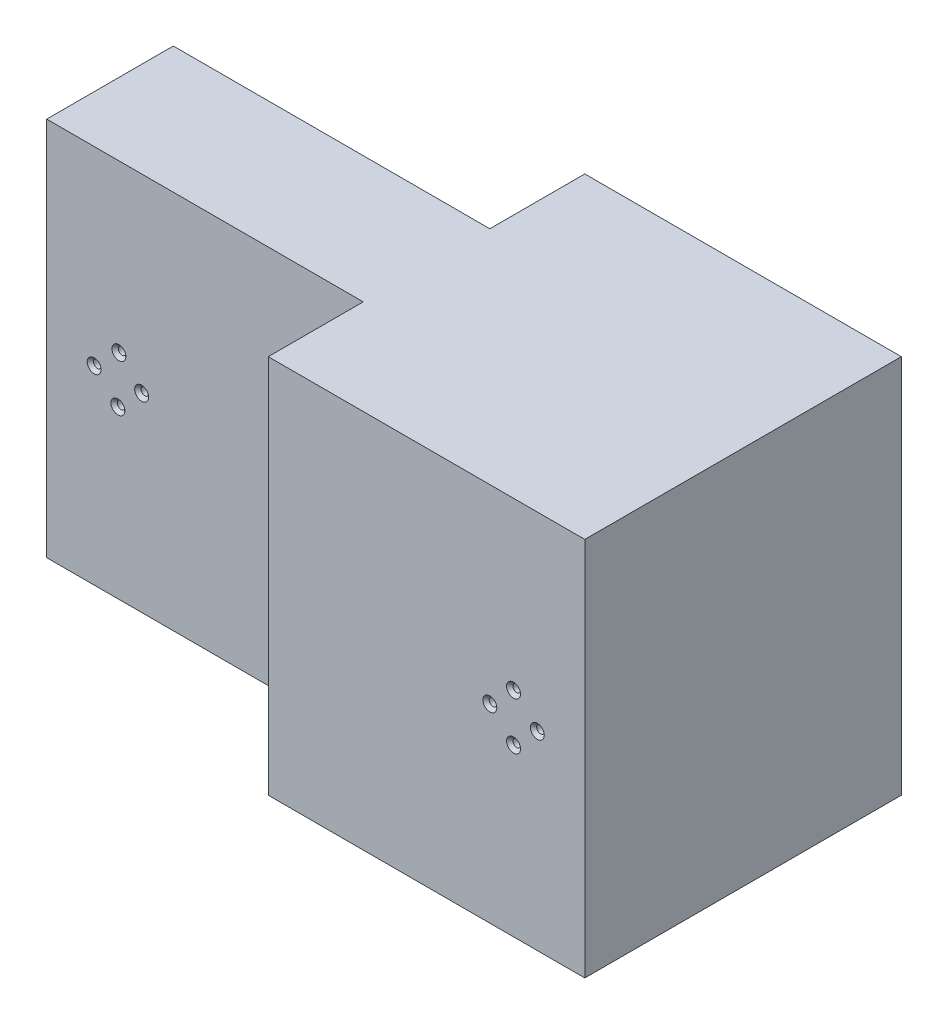
ISO-10303-21;
HEADER;
FILE_DESCRIPTION(('STEP AP214'),'2;1');
FILE_NAME('part.step','',(''),(''),'','','');
FILE_SCHEMA(('AUTOMOTIVE_DESIGN { 1 0 10303 214 1 1 1 1 }'));
ENDSEC;
DATA;
#1=APPLICATION_CONTEXT('core data for automotive mechanical design processes');
#2=APPLICATION_PROTOCOL_DEFINITION('international standard','automotive_design',2000,#1);
#3=PRODUCT_CONTEXT('',#1,'mechanical');
#4=PRODUCT('Part','Part','',(#3));
#5=PRODUCT_RELATED_PRODUCT_CATEGORY('part','',(#4));
#6=PRODUCT_DEFINITION_FORMATION('','',#4);
#7=PRODUCT_DEFINITION_CONTEXT('part definition',#1,'design');
#8=PRODUCT_DEFINITION('design','',#6,#7);
#9=PRODUCT_DEFINITION_SHAPE('','',#8);
#10=(LENGTH_UNIT() NAMED_UNIT(*) SI_UNIT(.MILLI.,.METRE.));
#11=(NAMED_UNIT(*) PLANE_ANGLE_UNIT() SI_UNIT($,.RADIAN.));
#12=(NAMED_UNIT(*) SI_UNIT($,.STERADIAN.) SOLID_ANGLE_UNIT());
#13=UNCERTAINTY_MEASURE_WITH_UNIT(LENGTH_MEASURE(1.E-05),#10,'distance_accuracy_value','');
#14=(GEOMETRIC_REPRESENTATION_CONTEXT(3) GLOBAL_UNCERTAINTY_ASSIGNED_CONTEXT((#13)) GLOBAL_UNIT_ASSIGNED_CONTEXT((#10,
#11,#12)) REPRESENTATION_CONTEXT('',''));
#15=CARTESIAN_POINT('',(0.,0.,0.));
#16=DIRECTION('',(0.,0.,1.));
#17=DIRECTION('',(1.,0.,0.));
#18=AXIS2_PLACEMENT_3D('',#15,#16,#17);
#19=CARTESIAN_POINT('',(-100.,120.,-50.));
#20=DIRECTION('',(1.,0.,0.));
#21=DIRECTION('',(0.,0.,-1.));
#22=AXIS2_PLACEMENT_3D('',#19,#20,#21);
#23=PLANE('',#22);
#24=DIRECTION('',(0.,0.,1.));
#25=VECTOR('',#24,1.);
#26=CARTESIAN_POINT('',(-100.,120.,-50.));
#27=LINE('',#26,#25);
#28=CARTESIAN_POINT('',(-100.,120.,-20.));
#29=VERTEX_POINT('',#28);
#30=CARTESIAN_POINT('',(-100.,120.,20.));
#31=VERTEX_POINT('',#30);
#32=EDGE_CURVE('E184',#29,#31,#27,.T.);
#33=ORIENTED_EDGE('',*,*,#32,.F.);
#34=DIRECTION('',(0.,1.,0.));
#35=VECTOR('',#34,1.);
#36=CARTESIAN_POINT('',(-100.,120.,-20.));
#37=LINE('',#36,#35);
#38=CARTESIAN_POINT('',(-100.,0.,-20.));
#39=VERTEX_POINT('',#38);
#40=EDGE_CURVE('E170',#39,#29,#37,.T.);
#41=ORIENTED_EDGE('',*,*,#40,.F.);
#42=DIRECTION('',(0.,0.,1.));
#43=VECTOR('',#42,1.);
#44=CARTESIAN_POINT('',(-100.,0.,-50.));
#45=LINE('',#44,#43);
#46=CARTESIAN_POINT('',(-100.,0.,20.));
#47=VERTEX_POINT('',#46);
#48=EDGE_CURVE('E129',#39,#47,#45,.T.);
#49=ORIENTED_EDGE('',*,*,#48,.T.);
#50=DIRECTION('',(0.,-1.,0.));
#51=VECTOR('',#50,1.);
#52=CARTESIAN_POINT('',(-100.,120.,20.));
#53=LINE('',#52,#51);
#54=EDGE_CURVE('E190',#31,#47,#53,.T.);
#55=ORIENTED_EDGE('',*,*,#54,.F.);
#56=EDGE_LOOP('',(#33,#41,#49,#55));
#57=FACE_BOUND('',#56,.T.);
#58=ADVANCED_FACE('F43',(#57),#23,.F.);
#59=CARTESIAN_POINT('',(100.,120.,-50.));
#60=DIRECTION('',(-1.,0.,0.));
#61=DIRECTION('',(0.,0.,1.));
#62=AXIS2_PLACEMENT_3D('',#59,#60,#61);
#63=PLANE('',#62);
#64=DIRECTION('',(0.,0.,-1.));
#65=VECTOR('',#64,1.);
#66=CARTESIAN_POINT('',(100.,0.,-50.));
#67=LINE('',#66,#65);
#68=CARTESIAN_POINT('',(100.,0.,50.));
#69=VERTEX_POINT('',#68);
#70=CARTESIAN_POINT('',(100.,0.,-50.));
#71=VERTEX_POINT('',#70);
#72=EDGE_CURVE('E203',#69,#71,#67,.T.);
#73=ORIENTED_EDGE('',*,*,#72,.T.);
#74=DIRECTION('',(0.,-1.,0.));
#75=VECTOR('',#74,1.);
#76=CARTESIAN_POINT('',(100.,120.,-50.));
#77=LINE('',#76,#75);
#78=CARTESIAN_POINT('',(100.,120.,-50.));
#79=VERTEX_POINT('',#78);
#80=EDGE_CURVE('E220',#79,#71,#77,.T.);
#81=ORIENTED_EDGE('',*,*,#80,.F.);
#82=DIRECTION('',(0.,0.,-1.));
#83=VECTOR('',#82,1.);
#84=CARTESIAN_POINT('',(100.,120.,-50.));
#85=LINE('',#84,#83);
#86=CARTESIAN_POINT('',(100.,120.,50.));
#87=VERTEX_POINT('',#86);
#88=EDGE_CURVE('E199',#87,#79,#85,.T.);
#89=ORIENTED_EDGE('',*,*,#88,.F.);
#90=DIRECTION('',(0.,-1.,0.));
#91=VECTOR('',#90,1.);
#92=CARTESIAN_POINT('',(100.,120.,50.));
#93=LINE('',#92,#91);
#94=EDGE_CURVE('E197',#87,#69,#93,.T.);
#95=ORIENTED_EDGE('',*,*,#94,.T.);
#96=EDGE_LOOP('',(#73,#81,#89,#95));
#97=FACE_BOUND('',#96,.T.);
#98=ADVANCED_FACE('F427',(#97),#63,.F.);
#99=CARTESIAN_POINT('',(-100.,120.,-50.));
#100=DIRECTION('',(0.,0.,1.));
#101=DIRECTION('',(1.,0.,0.));
#102=AXIS2_PLACEMENT_3D('',#99,#100,#101);
#103=PLANE('',#102);
#104=DIRECTION('',(-1.,0.,0.));
#105=VECTOR('',#104,1.);
#106=CARTESIAN_POINT('',(-100.,0.,-50.));
#107=LINE('',#106,#105);
#108=CARTESIAN_POINT('',(0.,0.,-50.));
#109=VERTEX_POINT('',#108);
#110=EDGE_CURVE('E207',#71,#109,#107,.T.);
#111=ORIENTED_EDGE('',*,*,#110,.T.);
#112=DIRECTION('',(0.,-1.,0.));
#113=VECTOR('',#112,1.);
#114=CARTESIAN_POINT('',(0.,120.,-50.));
#115=LINE('',#114,#113);
#116=CARTESIAN_POINT('',(0.,120.,-50.));
#117=VERTEX_POINT('',#116);
#118=EDGE_CURVE('E179',#117,#109,#115,.T.);
#119=ORIENTED_EDGE('',*,*,#118,.F.);
#120=DIRECTION('',(-1.,0.,0.));
#121=VECTOR('',#120,1.);
#122=CARTESIAN_POINT('',(-100.,120.,-50.));
#123=LINE('',#122,#121);
#124=EDGE_CURVE('E193',#79,#117,#123,.T.);
#125=ORIENTED_EDGE('',*,*,#124,.F.);
#126=ORIENTED_EDGE('',*,*,#80,.T.);
#127=EDGE_LOOP('',(#111,#119,#125,#126));
#128=FACE_BOUND('',#127,.T.);
#129=ADVANCED_FACE('F430',(#128),#103,.F.);
#130=CARTESIAN_POINT('',(-100.,120.,50.));
#131=DIRECTION('',(0.,0.,-1.));
#132=DIRECTION('',(-1.,0.,0.));
#133=AXIS2_PLACEMENT_3D('',#130,#131,#132);
#134=PLANE('',#133);
#135=CARTESIAN_POINT('',(85.,60.,50.));
#136=DIRECTION('',(0.,0.,1.));
#137=DIRECTION('',(1.,0.,0.));
#138=AXIS2_PLACEMENT_3D('',#135,#136,#137);
#139=CIRCLE('',#138,2.19999999999999);
#140=CARTESIAN_POINT('',(87.2,60.,50.));
#141=VERTEX_POINT('',#140);
#142=EDGE_CURVE('E326',#141,#141,#139,.T.);
#143=ORIENTED_EDGE('',*,*,#142,.F.);
#144=EDGE_LOOP('',(#143));
#145=FACE_BOUND('',#144,.T.);
#146=CARTESIAN_POINT('',(70.,60.,50.));
#147=DIRECTION('',(0.,0.,1.));
#148=DIRECTION('',(1.,0.,0.));
#149=AXIS2_PLACEMENT_3D('',#146,#147,#148);
#150=CIRCLE('',#149,2.19999999999999);
#151=CARTESIAN_POINT('',(72.2,60.,50.));
#152=VERTEX_POINT('',#151);
#153=EDGE_CURVE('E320',#152,#152,#150,.T.);
#154=ORIENTED_EDGE('',*,*,#153,.F.);
#155=EDGE_LOOP('',(#154));
#156=FACE_BOUND('',#155,.T.);
#157=CARTESIAN_POINT('',(77.5,67.5,50.));
#158=DIRECTION('',(0.,0.,1.));
#159=DIRECTION('',(1.,0.,0.));
#160=AXIS2_PLACEMENT_3D('',#157,#158,#159);
#161=CIRCLE('',#160,2.19999999999999);
#162=CARTESIAN_POINT('',(79.7,67.5,50.));
#163=VERTEX_POINT('',#162);
#164=EDGE_CURVE('E314',#163,#163,#161,.T.);
#165=ORIENTED_EDGE('',*,*,#164,.F.);
#166=EDGE_LOOP('',(#165));
#167=FACE_BOUND('',#166,.T.);
#168=CARTESIAN_POINT('',(77.5,52.5,50.));
#169=DIRECTION('',(0.,0.,1.));
#170=DIRECTION('',(1.,0.,0.));
#171=AXIS2_PLACEMENT_3D('',#168,#169,#170);
#172=CIRCLE('',#171,2.19999999999999);
#173=CARTESIAN_POINT('',(79.7,52.5,50.));
#174=VERTEX_POINT('',#173);
#175=EDGE_CURVE('E308',#174,#174,#172,.T.);
#176=ORIENTED_EDGE('',*,*,#175,.F.);
#177=EDGE_LOOP('',(#176));
#178=FACE_BOUND('',#177,.T.);
#179=DIRECTION('',(1.,0.,0.));
#180=VECTOR('',#179,1.);
#181=CARTESIAN_POINT('',(-100.,120.,50.));
#182=LINE('',#181,#180);
#183=CARTESIAN_POINT('',(0.,120.,50.));
#184=VERTEX_POINT('',#183);
#185=EDGE_CURVE('E192',#184,#87,#182,.T.);
#186=ORIENTED_EDGE('',*,*,#185,.F.);
#187=DIRECTION('',(0.,1.,0.));
#188=VECTOR('',#187,1.);
#189=CARTESIAN_POINT('',(0.,120.,50.));
#190=LINE('',#189,#188);
#191=CARTESIAN_POINT('',(0.,0.,50.));
#192=VERTEX_POINT('',#191);
#193=EDGE_CURVE('E397',#192,#184,#190,.T.);
#194=ORIENTED_EDGE('',*,*,#193,.F.);
#195=DIRECTION('',(1.,0.,0.));
#196=VECTOR('',#195,1.);
#197=CARTESIAN_POINT('',(-100.,0.,50.));
#198=LINE('',#197,#196);
#199=EDGE_CURVE('E214',#192,#69,#198,.T.);
#200=ORIENTED_EDGE('',*,*,#199,.T.);
#201=ORIENTED_EDGE('',*,*,#94,.F.);
#202=EDGE_LOOP('',(#186,#194,#200,#201));
#203=FACE_BOUND('',#202,.T.);
#204=ADVANCED_FACE('F444',(#145,#156,#167,#178,#203),#134,.F.);
#205=CARTESIAN_POINT('',(0.,120.,0.));
#206=DIRECTION('',(0.,1.,0.));
#207=DIRECTION('',(0.,0.,1.));
#208=AXIS2_PLACEMENT_3D('',#205,#206,#207);
#209=PLANE('',#208);
#210=DIRECTION('',(0.,0.,-1.));
#211=VECTOR('',#210,1.);
#212=CARTESIAN_POINT('',(0.,120.,-20.));
#213=LINE('',#212,#211);
#214=CARTESIAN_POINT('',(0.,120.,-20.));
#215=VERTEX_POINT('',#214);
#216=EDGE_CURVE('E187',#215,#117,#213,.T.);
#217=ORIENTED_EDGE('',*,*,#216,.F.);
#218=DIRECTION('',(1.,0.,0.));
#219=VECTOR('',#218,1.);
#220=CARTESIAN_POINT('',(-100.,120.,-20.));
#221=LINE('',#220,#219);
#222=EDGE_CURVE('E173',#29,#215,#221,.T.);
#223=ORIENTED_EDGE('',*,*,#222,.F.);
#224=ORIENTED_EDGE('',*,*,#32,.T.);
#225=DIRECTION('',(-1.,0.,0.));
#226=VECTOR('',#225,1.);
#227=CARTESIAN_POINT('',(-100.,120.,20.));
#228=LINE('',#227,#226);
#229=CARTESIAN_POINT('',(0.,120.,20.));
#230=VERTEX_POINT('',#229);
#231=EDGE_CURVE('E410',#230,#31,#228,.T.);
#232=ORIENTED_EDGE('',*,*,#231,.F.);
#233=DIRECTION('',(0.,0.,1.));
#234=VECTOR('',#233,1.);
#235=CARTESIAN_POINT('',(0.,120.,20.));
#236=LINE('',#235,#234);
#237=EDGE_CURVE('E208',#230,#184,#236,.T.);
#238=ORIENTED_EDGE('',*,*,#237,.T.);
#239=ORIENTED_EDGE('',*,*,#185,.T.);
#240=ORIENTED_EDGE('',*,*,#88,.T.);
#241=ORIENTED_EDGE('',*,*,#124,.T.);
#242=EDGE_LOOP('',(#217,#223,#224,#232,#238,#239,#240,#241));
#243=FACE_BOUND('',#242,.T.);
#244=ADVANCED_FACE('F182',(#243),#209,.T.);
#245=CARTESIAN_POINT('',(0.,0.,0.));
#246=DIRECTION('',(0.,1.,0.));
#247=DIRECTION('',(0.,0.,1.));
#248=AXIS2_PLACEMENT_3D('',#245,#246,#247);
#249=PLANE('',#248);
#250=DIRECTION('',(-1.,0.,0.));
#251=VECTOR('',#250,1.);
#252=CARTESIAN_POINT('',(-100.,0.,-20.));
#253=LINE('',#252,#251);
#254=CARTESIAN_POINT('',(0.,0.,-20.));
#255=VERTEX_POINT('',#254);
#256=EDGE_CURVE('E176',#255,#39,#253,.T.);
#257=ORIENTED_EDGE('',*,*,#256,.F.);
#258=DIRECTION('',(0.,0.,-1.));
#259=VECTOR('',#258,1.);
#260=CARTESIAN_POINT('',(0.,0.,-20.));
#261=LINE('',#260,#259);
#262=EDGE_CURVE('E393',#255,#109,#261,.T.);
#263=ORIENTED_EDGE('',*,*,#262,.T.);
#264=ORIENTED_EDGE('',*,*,#110,.F.);
#265=ORIENTED_EDGE('',*,*,#72,.F.);
#266=ORIENTED_EDGE('',*,*,#199,.F.);
#267=DIRECTION('',(0.,0.,1.));
#268=VECTOR('',#267,1.);
#269=CARTESIAN_POINT('',(0.,0.,20.));
#270=LINE('',#269,#268);
#271=CARTESIAN_POINT('',(0.,0.,20.));
#272=VERTEX_POINT('',#271);
#273=EDGE_CURVE('E413',#272,#192,#270,.T.);
#274=ORIENTED_EDGE('',*,*,#273,.F.);
#275=DIRECTION('',(1.,0.,0.));
#276=VECTOR('',#275,1.);
#277=CARTESIAN_POINT('',(-100.,0.,20.));
#278=LINE('',#277,#276);
#279=EDGE_CURVE('E402',#47,#272,#278,.T.);
#280=ORIENTED_EDGE('',*,*,#279,.F.);
#281=ORIENTED_EDGE('',*,*,#48,.F.);
#282=EDGE_LOOP('',(#257,#263,#264,#265,#266,#274,#280,#281));
#283=FACE_BOUND('',#282,.T.);
#284=ADVANCED_FACE('F435',(#283),#249,.F.);
#285=CARTESIAN_POINT('',(0.,120.,20.));
#286=DIRECTION('',(1.,0.,0.));
#287=DIRECTION('',(0.,0.,-1.));
#288=AXIS2_PLACEMENT_3D('',#285,#286,#287);
#289=PLANE('',#288);
#290=ORIENTED_EDGE('',*,*,#193,.T.);
#291=ORIENTED_EDGE('',*,*,#237,.F.);
#292=DIRECTION('',(0.,1.,0.));
#293=VECTOR('',#292,1.);
#294=CARTESIAN_POINT('',(0.,120.,20.));
#295=LINE('',#294,#293);
#296=EDGE_CURVE('E406',#272,#230,#295,.T.);
#297=ORIENTED_EDGE('',*,*,#296,.F.);
#298=ORIENTED_EDGE('',*,*,#273,.T.);
#299=EDGE_LOOP('',(#290,#291,#297,#298));
#300=FACE_BOUND('',#299,.T.);
#301=ADVANCED_FACE('F445',(#300),#289,.F.);
#302=CARTESIAN_POINT('',(0.,0.,20.));
#303=DIRECTION('',(0.,0.,1.));
#304=DIRECTION('',(1.,0.,0.));
#305=AXIS2_PLACEMENT_3D('',#302,#303,#304);
#306=PLANE('',#305);
#307=CARTESIAN_POINT('',(-85.,60.,20.));
#308=DIRECTION('',(0.,0.,1.));
#309=DIRECTION('',(1.,0.,0.));
#310=AXIS2_PLACEMENT_3D('',#307,#308,#309);
#311=CIRCLE('',#310,2.19999999999999);
#312=CARTESIAN_POINT('',(-82.8,60.,20.));
#313=VERTEX_POINT('',#312);
#314=EDGE_CURVE('E901',#313,#313,#311,.T.);
#315=ORIENTED_EDGE('',*,*,#314,.F.);
#316=EDGE_LOOP('',(#315));
#317=FACE_BOUND('',#316,.T.);
#318=CARTESIAN_POINT('',(-77.1792614134675,67.5,20.));
#319=DIRECTION('',(0.,0.,1.));
#320=DIRECTION('',(1.,0.,0.));
#321=AXIS2_PLACEMENT_3D('',#318,#319,#320);
#322=CIRCLE('',#321,2.20000000000001);
#323=CARTESIAN_POINT('',(-74.9792614134674,67.5,20.));
#324=VERTEX_POINT('',#323);
#325=EDGE_CURVE('E345',#324,#324,#322,.T.);
#326=ORIENTED_EDGE('',*,*,#325,.F.);
#327=EDGE_LOOP('',(#326));
#328=FACE_BOUND('',#327,.T.);
#329=CARTESIAN_POINT('',(-70.,60.,20.));
#330=DIRECTION('',(0.,0.,1.));
#331=DIRECTION('',(1.,0.,0.));
#332=AXIS2_PLACEMENT_3D('',#329,#330,#331);
#333=CIRCLE('',#332,2.20000000000001);
#334=CARTESIAN_POINT('',(-67.8,60.,20.));
#335=VERTEX_POINT('',#334);
#336=EDGE_CURVE('E336',#335,#335,#333,.T.);
#337=ORIENTED_EDGE('',*,*,#336,.F.);
#338=EDGE_LOOP('',(#337));
#339=FACE_BOUND('',#338,.T.);
#340=CARTESIAN_POINT('',(-77.5,52.5034295000787,20.));
#341=DIRECTION('',(0.,0.,1.));
#342=DIRECTION('',(1.,0.,0.));
#343=AXIS2_PLACEMENT_3D('',#340,#341,#342);
#344=CIRCLE('',#343,2.20000000000001);
#345=CARTESIAN_POINT('',(-75.3,52.5034295000787,20.));
#346=VERTEX_POINT('',#345);
#347=EDGE_CURVE('E331',#346,#346,#344,.T.);
#348=ORIENTED_EDGE('',*,*,#347,.F.);
#349=EDGE_LOOP('',(#348));
#350=FACE_BOUND('',#349,.T.);
#351=ORIENTED_EDGE('',*,*,#54,.T.);
#352=ORIENTED_EDGE('',*,*,#279,.T.);
#353=ORIENTED_EDGE('',*,*,#296,.T.);
#354=ORIENTED_EDGE('',*,*,#231,.T.);
#355=EDGE_LOOP('',(#351,#352,#353,#354));
#356=FACE_BOUND('',#355,.T.);
#357=ADVANCED_FACE('F440',(#317,#328,#339,#350,#356),#306,.T.);
#358=CARTESIAN_POINT('',(0.,120.,-20.));
#359=DIRECTION('',(1.,0.,0.));
#360=DIRECTION('',(0.,0.,-1.));
#361=AXIS2_PLACEMENT_3D('',#358,#359,#360);
#362=PLANE('',#361);
#363=ORIENTED_EDGE('',*,*,#118,.T.);
#364=ORIENTED_EDGE('',*,*,#262,.F.);
#365=DIRECTION('',(0.,-1.,0.));
#366=VECTOR('',#365,1.);
#367=CARTESIAN_POINT('',(0.,120.,-20.));
#368=LINE('',#367,#366);
#369=EDGE_CURVE('E121',#215,#255,#368,.T.);
#370=ORIENTED_EDGE('',*,*,#369,.F.);
#371=ORIENTED_EDGE('',*,*,#216,.T.);
#372=EDGE_LOOP('',(#363,#364,#370,#371));
#373=FACE_BOUND('',#372,.T.);
#374=ADVANCED_FACE('F433',(#373),#362,.F.);
#375=CARTESIAN_POINT('',(0.,0.,-20.));
#376=DIRECTION('',(0.,0.,1.));
#377=DIRECTION('',(1.,0.,0.));
#378=AXIS2_PLACEMENT_3D('',#375,#376,#377);
#379=PLANE('',#378);
#380=ORIENTED_EDGE('',*,*,#40,.T.);
#381=ORIENTED_EDGE('',*,*,#222,.T.);
#382=ORIENTED_EDGE('',*,*,#369,.T.);
#383=ORIENTED_EDGE('',*,*,#256,.T.);
#384=EDGE_LOOP('',(#380,#381,#382,#383));
#385=FACE_BOUND('',#384,.T.);
#386=ADVANCED_FACE('F172',(#385),#379,.F.);
#387=CARTESIAN_POINT('',(77.5,52.5,50.));
#388=DIRECTION('',(0.,0.,1.));
#389=DIRECTION('',(1.,0.,0.));
#390=AXIS2_PLACEMENT_3D('',#387,#388,#389);
#391=CYLINDRICAL_SURFACE('',#390,1.19999999999999);
#392=CARTESIAN_POINT('',(77.5,52.5,40.));
#393=DIRECTION('',(0.,0.,-1.));
#394=DIRECTION('',(-1.,0.,0.));
#395=AXIS2_PLACEMENT_3D('',#392,#393,#394);
#396=CIRCLE('',#395,1.19999999999999);
#397=CARTESIAN_POINT('',(76.3,52.5,40.));
#398=VERTEX_POINT('',#397);
#399=EDGE_CURVE('E299',#398,#398,#396,.T.);
#400=ORIENTED_EDGE('',*,*,#399,.T.);
#401=EDGE_LOOP('',(#400));
#402=FACE_BOUND('',#401,.T.);
#403=CARTESIAN_POINT('',(77.5,52.5,49.));
#404=DIRECTION('',(0.,0.,1.));
#405=DIRECTION('',(1.,0.,0.));
#406=AXIS2_PLACEMENT_3D('',#403,#404,#405);
#407=CIRCLE('',#406,1.19999999999999);
#408=CARTESIAN_POINT('',(78.7,52.5,49.));
#409=VERTEX_POINT('',#408);
#410=EDGE_CURVE('E303',#409,#409,#407,.T.);
#411=ORIENTED_EDGE('',*,*,#410,.T.);
#412=EDGE_LOOP('',(#411));
#413=FACE_BOUND('',#412,.T.);
#414=ADVANCED_FACE('F537',(#402,#413),#391,.F.);
#415=CARTESIAN_POINT('',(77.5,52.5,50.));
#416=DIRECTION('',(0.,0.,1.));
#417=DIRECTION('',(1.,0.,0.));
#418=AXIS2_PLACEMENT_3D('',#415,#416,#417);
#419=CONICAL_SURFACE('',#418,2.19999999999999,0.785398163397448);
#420=ORIENTED_EDGE('',*,*,#410,.F.);
#421=EDGE_LOOP('',(#420));
#422=FACE_BOUND('',#421,.T.);
#423=ORIENTED_EDGE('',*,*,#175,.T.);
#424=EDGE_LOOP('',(#423));
#425=FACE_BOUND('',#424,.T.);
#426=ADVANCED_FACE('F470',(#422,#425),#419,.F.);
#427=CARTESIAN_POINT('',(-90.,120.,-50.));
#428=DIRECTION('',(1.,0.,0.));
#429=DIRECTION('',(0.,0.,-1.));
#430=AXIS2_PLACEMENT_3D('',#427,#428,#429);
#431=PLANE('',#430);
#432=DIRECTION('',(0.,0.,1.));
#433=VECTOR('',#432,1.);
#434=CARTESIAN_POINT('',(-90.,110.,-50.));
#435=LINE('',#434,#433);
#436=CARTESIAN_POINT('',(-90.,110.,-10.));
#437=VERTEX_POINT('',#436);
#438=CARTESIAN_POINT('',(-90.,110.,10.));
#439=VERTEX_POINT('',#438);
#440=EDGE_CURVE('E275',#437,#439,#435,.T.);
#441=ORIENTED_EDGE('',*,*,#440,.T.);
#442=DIRECTION('',(0.,-1.,0.));
#443=VECTOR('',#442,1.);
#444=CARTESIAN_POINT('',(-90.,120.,10.));
#445=LINE('',#444,#443);
#446=CARTESIAN_POINT('',(-90.,10.,10.));
#447=VERTEX_POINT('',#446);
#448=EDGE_CURVE('E250',#439,#447,#445,.T.);
#449=ORIENTED_EDGE('',*,*,#448,.T.);
#450=DIRECTION('',(0.,0.,1.));
#451=VECTOR('',#450,1.);
#452=CARTESIAN_POINT('',(-90.,9.99999999999999,-50.));
#453=LINE('',#452,#451);
#454=CARTESIAN_POINT('',(-90.,10.,-10.));
#455=VERTEX_POINT('',#454);
#456=EDGE_CURVE('E113',#455,#447,#453,.T.);
#457=ORIENTED_EDGE('',*,*,#456,.F.);
#458=DIRECTION('',(0.,1.,0.));
#459=VECTOR('',#458,1.);
#460=CARTESIAN_POINT('',(-90.,0.,-10.));
#461=LINE('',#460,#459);
#462=EDGE_CURVE('E230',#455,#437,#461,.T.);
#463=ORIENTED_EDGE('',*,*,#462,.T.);
#464=EDGE_LOOP('',(#441,#449,#457,#463));
#465=FACE_BOUND('',#464,.T.);
#466=ADVANCED_FACE('F466',(#465),#431,.T.);
#467=CARTESIAN_POINT('',(90.,120.,-50.));
#468=DIRECTION('',(-1.,0.,0.));
#469=DIRECTION('',(0.,0.,1.));
#470=AXIS2_PLACEMENT_3D('',#467,#468,#469);
#471=PLANE('',#470);
#472=DIRECTION('',(0.,0.,-1.));
#473=VECTOR('',#472,1.);
#474=CARTESIAN_POINT('',(90.,9.99999999999999,-50.));
#475=LINE('',#474,#473);
#476=CARTESIAN_POINT('',(90.,10.,40.));
#477=VERTEX_POINT('',#476);
#478=CARTESIAN_POINT('',(90.,10.,-40.));
#479=VERTEX_POINT('',#478);
#480=EDGE_CURVE('E293',#477,#479,#475,.T.);
#481=ORIENTED_EDGE('',*,*,#480,.F.);
#482=DIRECTION('',(0.,-1.,0.));
#483=VECTOR('',#482,1.);
#484=CARTESIAN_POINT('',(90.,120.,40.));
#485=LINE('',#484,#483);
#486=CARTESIAN_POINT('',(90.,110.,40.));
#487=VERTEX_POINT('',#486);
#488=EDGE_CURVE('E289',#487,#477,#485,.T.);
#489=ORIENTED_EDGE('',*,*,#488,.F.);
#490=DIRECTION('',(0.,0.,-1.));
#491=VECTOR('',#490,1.);
#492=CARTESIAN_POINT('',(90.,110.,-50.));
#493=LINE('',#492,#491);
#494=CARTESIAN_POINT('',(90.,110.,-40.));
#495=VERTEX_POINT('',#494);
#496=EDGE_CURVE('E265',#487,#495,#493,.T.);
#497=ORIENTED_EDGE('',*,*,#496,.T.);
#498=DIRECTION('',(0.,-1.,0.));
#499=VECTOR('',#498,1.);
#500=CARTESIAN_POINT('',(90.,120.,-40.));
#501=LINE('',#500,#499);
#502=EDGE_CURVE('E281',#495,#479,#501,.T.);
#503=ORIENTED_EDGE('',*,*,#502,.T.);
#504=EDGE_LOOP('',(#481,#489,#497,#503));
#505=FACE_BOUND('',#504,.T.);
#506=ADVANCED_FACE('F469',(#505),#471,.T.);
#507=CARTESIAN_POINT('',(-100.,120.,-40.));
#508=DIRECTION('',(0.,0.,1.));
#509=DIRECTION('',(1.,0.,0.));
#510=AXIS2_PLACEMENT_3D('',#507,#508,#509);
#511=PLANE('',#510);
#512=DIRECTION('',(-1.,0.,0.));
#513=VECTOR('',#512,1.);
#514=CARTESIAN_POINT('',(-100.,9.99999999999999,-40.));
#515=LINE('',#514,#513);
#516=CARTESIAN_POINT('',(10.,10.,-40.));
#517=VERTEX_POINT('',#516);
#518=EDGE_CURVE('E285',#479,#517,#515,.T.);
#519=ORIENTED_EDGE('',*,*,#518,.F.);
#520=ORIENTED_EDGE('',*,*,#502,.F.);
#521=DIRECTION('',(-1.,0.,0.));
#522=VECTOR('',#521,1.);
#523=CARTESIAN_POINT('',(-100.,110.,-40.));
#524=LINE('',#523,#522);
#525=CARTESIAN_POINT('',(10.,110.,-40.));
#526=VERTEX_POINT('',#525);
#527=EDGE_CURVE('E109',#495,#526,#524,.T.);
#528=ORIENTED_EDGE('',*,*,#527,.T.);
#529=DIRECTION('',(0.,-1.,0.));
#530=VECTOR('',#529,1.);
#531=CARTESIAN_POINT('',(10.,120.,-40.));
#532=LINE('',#531,#530);
#533=EDGE_CURVE('E236',#526,#517,#532,.T.);
#534=ORIENTED_EDGE('',*,*,#533,.T.);
#535=EDGE_LOOP('',(#519,#520,#528,#534));
#536=FACE_BOUND('',#535,.T.);
#537=ADVANCED_FACE('F474',(#536),#511,.T.);
#538=CARTESIAN_POINT('',(-100.,120.,40.));
#539=DIRECTION('',(0.,0.,-1.));
#540=DIRECTION('',(-1.,0.,0.));
#541=AXIS2_PLACEMENT_3D('',#538,#539,#540);
#542=PLANE('',#541);
#543=CARTESIAN_POINT('',(85.,60.,40.));
#544=DIRECTION('',(0.,0.,-1.));
#545=DIRECTION('',(-1.,0.,0.));
#546=AXIS2_PLACEMENT_3D('',#543,#544,#545);
#547=CIRCLE('',#546,1.19999999999999);
#548=CARTESIAN_POINT('',(83.8,60.,40.));
#549=VERTEX_POINT('',#548);
#550=EDGE_CURVE('E316',#549,#549,#547,.T.);
#551=ORIENTED_EDGE('',*,*,#550,.F.);
#552=EDGE_LOOP('',(#551));
#553=FACE_BOUND('',#552,.T.);
#554=CARTESIAN_POINT('',(70.,60.,40.));
#555=DIRECTION('',(0.,0.,-1.));
#556=DIRECTION('',(-1.,0.,0.));
#557=AXIS2_PLACEMENT_3D('',#554,#555,#556);
#558=CIRCLE('',#557,1.19999999999999);
#559=CARTESIAN_POINT('',(68.8,60.,40.));
#560=VERTEX_POINT('',#559);
#561=EDGE_CURVE('E310',#560,#560,#558,.T.);
#562=ORIENTED_EDGE('',*,*,#561,.F.);
#563=EDGE_LOOP('',(#562));
#564=FACE_BOUND('',#563,.T.);
#565=CARTESIAN_POINT('',(77.5,67.5,40.));
#566=DIRECTION('',(0.,0.,-1.));
#567=DIRECTION('',(-1.,0.,0.));
#568=AXIS2_PLACEMENT_3D('',#565,#566,#567);
#569=CIRCLE('',#568,1.19999999999999);
#570=CARTESIAN_POINT('',(76.3,67.5,40.));
#571=VERTEX_POINT('',#570);
#572=EDGE_CURVE('E304',#571,#571,#569,.T.);
#573=ORIENTED_EDGE('',*,*,#572,.F.);
#574=EDGE_LOOP('',(#573));
#575=FACE_BOUND('',#574,.T.);
#576=ORIENTED_EDGE('',*,*,#399,.F.);
#577=EDGE_LOOP('',(#576));
#578=FACE_BOUND('',#577,.T.);
#579=DIRECTION('',(1.,0.,0.));
#580=VECTOR('',#579,1.);
#581=CARTESIAN_POINT('',(-100.,110.,40.));
#582=LINE('',#581,#580);
#583=CARTESIAN_POINT('',(10.,110.,40.));
#584=VERTEX_POINT('',#583);
#585=EDGE_CURVE('E268',#584,#487,#582,.T.);
#586=ORIENTED_EDGE('',*,*,#585,.T.);
#587=ORIENTED_EDGE('',*,*,#488,.T.);
#588=DIRECTION('',(1.,0.,0.));
#589=VECTOR('',#588,1.);
#590=CARTESIAN_POINT('',(-100.,9.99999999999999,40.));
#591=LINE('',#590,#589);
#592=CARTESIAN_POINT('',(10.,10.,40.));
#593=VERTEX_POINT('',#592);
#594=EDGE_CURVE('E278',#593,#477,#591,.T.);
#595=ORIENTED_EDGE('',*,*,#594,.F.);
#596=DIRECTION('',(0.,1.,0.));
#597=VECTOR('',#596,1.);
#598=CARTESIAN_POINT('',(10.,120.,40.));
#599=LINE('',#598,#597);
#600=EDGE_CURVE('E256',#593,#584,#599,.T.);
#601=ORIENTED_EDGE('',*,*,#600,.T.);
#602=EDGE_LOOP('',(#586,#587,#595,#601));
#603=FACE_BOUND('',#602,.T.);
#604=ADVANCED_FACE('F478',(#553,#564,#575,#578,#603),#542,.T.);
#605=CARTESIAN_POINT('',(0.,110.,0.));
#606=DIRECTION('',(0.,1.,0.));
#607=DIRECTION('',(0.,0.,1.));
#608=AXIS2_PLACEMENT_3D('',#605,#606,#607);
#609=PLANE('',#608);
#610=DIRECTION('',(0.,0.,-1.));
#611=VECTOR('',#610,1.);
#612=CARTESIAN_POINT('',(10.,110.,0.));
#613=LINE('',#612,#611);
#614=CARTESIAN_POINT('',(10.,110.,-10.));
#615=VERTEX_POINT('',#614);
#616=EDGE_CURVE('E233',#615,#526,#613,.T.);
#617=ORIENTED_EDGE('',*,*,#616,.T.);
#618=ORIENTED_EDGE('',*,*,#527,.F.);
#619=ORIENTED_EDGE('',*,*,#496,.F.);
#620=ORIENTED_EDGE('',*,*,#585,.F.);
#621=DIRECTION('',(0.,0.,1.));
#622=VECTOR('',#621,1.);
#623=CARTESIAN_POINT('',(10.,110.,20.));
#624=LINE('',#623,#622);
#625=CARTESIAN_POINT('',(10.,110.,10.));
#626=VERTEX_POINT('',#625);
#627=EDGE_CURVE('E271',#626,#584,#624,.T.);
#628=ORIENTED_EDGE('',*,*,#627,.F.);
#629=DIRECTION('',(-1.,0.,0.));
#630=VECTOR('',#629,1.);
#631=CARTESIAN_POINT('',(0.,110.,10.));
#632=LINE('',#631,#630);
#633=EDGE_CURVE('E239',#626,#439,#632,.T.);
#634=ORIENTED_EDGE('',*,*,#633,.T.);
#635=ORIENTED_EDGE('',*,*,#440,.F.);
#636=DIRECTION('',(1.,0.,0.));
#637=VECTOR('',#636,1.);
#638=CARTESIAN_POINT('',(0.,110.,-10.));
#639=LINE('',#638,#637);
#640=EDGE_CURVE('E226',#437,#615,#639,.T.);
#641=ORIENTED_EDGE('',*,*,#640,.T.);
#642=EDGE_LOOP('',(#617,#618,#619,#620,#628,#634,#635,#641));
#643=FACE_BOUND('',#642,.T.);
#644=ADVANCED_FACE('F482',(#643),#609,.F.);
#645=CARTESIAN_POINT('',(0.,10.,0.));
#646=DIRECTION('',(0.,1.,0.));
#647=DIRECTION('',(0.,0.,1.));
#648=AXIS2_PLACEMENT_3D('',#645,#646,#647);
#649=PLANE('',#648);
#650=DIRECTION('',(-1.,0.,0.));
#651=VECTOR('',#650,1.);
#652=CARTESIAN_POINT('',(0.,10.,-10.));
#653=LINE('',#652,#651);
#654=CARTESIAN_POINT('',(10.,10.,-10.));
#655=VERTEX_POINT('',#654);
#656=EDGE_CURVE('E11',#655,#455,#653,.T.);
#657=ORIENTED_EDGE('',*,*,#656,.T.);
#658=ORIENTED_EDGE('',*,*,#456,.T.);
#659=DIRECTION('',(1.,0.,0.));
#660=VECTOR('',#659,1.);
#661=CARTESIAN_POINT('',(0.,10.,10.));
#662=LINE('',#661,#660);
#663=CARTESIAN_POINT('',(10.,10.,10.));
#664=VERTEX_POINT('',#663);
#665=EDGE_CURVE('E247',#447,#664,#662,.T.);
#666=ORIENTED_EDGE('',*,*,#665,.T.);
#667=DIRECTION('',(0.,0.,1.));
#668=VECTOR('',#667,1.);
#669=CARTESIAN_POINT('',(10.,9.99999999999999,20.));
#670=LINE('',#669,#668);
#671=EDGE_CURVE('E253',#664,#593,#670,.T.);
#672=ORIENTED_EDGE('',*,*,#671,.T.);
#673=ORIENTED_EDGE('',*,*,#594,.T.);
#674=ORIENTED_EDGE('',*,*,#480,.T.);
#675=ORIENTED_EDGE('',*,*,#518,.T.);
#676=DIRECTION('',(0.,0.,-1.));
#677=VECTOR('',#676,1.);
#678=CARTESIAN_POINT('',(10.,10.,0.));
#679=LINE('',#678,#677);
#680=EDGE_CURVE('E259',#655,#517,#679,.T.);
#681=ORIENTED_EDGE('',*,*,#680,.F.);
#682=EDGE_LOOP('',(#657,#658,#666,#672,#673,#674,#675,#681));
#683=FACE_BOUND('',#682,.T.);
#684=ADVANCED_FACE('F486',(#683),#649,.T.);
#685=CARTESIAN_POINT('',(10.,120.,20.));
#686=DIRECTION('',(1.,0.,0.));
#687=DIRECTION('',(0.,0.,-1.));
#688=AXIS2_PLACEMENT_3D('',#685,#686,#687);
#689=PLANE('',#688);
#690=ORIENTED_EDGE('',*,*,#600,.F.);
#691=ORIENTED_EDGE('',*,*,#671,.F.);
#692=DIRECTION('',(0.,1.,0.));
#693=VECTOR('',#692,1.);
#694=CARTESIAN_POINT('',(10.,0.,10.));
#695=LINE('',#694,#693);
#696=EDGE_CURVE('E243',#664,#626,#695,.T.);
#697=ORIENTED_EDGE('',*,*,#696,.T.);
#698=ORIENTED_EDGE('',*,*,#627,.T.);
#699=EDGE_LOOP('',(#690,#691,#697,#698));
#700=FACE_BOUND('',#699,.T.);
#701=ADVANCED_FACE('F489',(#700),#689,.T.);
#702=CARTESIAN_POINT('',(0.,0.,10.));
#703=DIRECTION('',(0.,0.,1.));
#704=DIRECTION('',(1.,0.,0.));
#705=AXIS2_PLACEMENT_3D('',#702,#703,#704);
#706=PLANE('',#705);
#707=CARTESIAN_POINT('',(-85.,60.,10.));
#708=DIRECTION('',(0.,0.,1.));
#709=DIRECTION('',(1.,0.,0.));
#710=AXIS2_PLACEMENT_3D('',#707,#708,#709);
#711=CIRCLE('',#710,1.19999999999999);
#712=CARTESIAN_POINT('',(-83.8,60.,10.));
#713=VERTEX_POINT('',#712);
#714=EDGE_CURVE('E47',#713,#713,#711,.T.);
#715=ORIENTED_EDGE('',*,*,#714,.T.);
#716=EDGE_LOOP('',(#715));
#717=FACE_BOUND('',#716,.T.);
#718=CARTESIAN_POINT('',(-77.1792614134675,67.5,10.));
#719=DIRECTION('',(0.,0.,1.));
#720=DIRECTION('',(1.,0.,0.));
#721=AXIS2_PLACEMENT_3D('',#718,#719,#720);
#722=CIRCLE('',#721,1.19999999999999);
#723=CARTESIAN_POINT('',(-75.9792614134675,67.5,10.));
#724=VERTEX_POINT('',#723);
#725=EDGE_CURVE('E333',#724,#724,#722,.T.);
#726=ORIENTED_EDGE('',*,*,#725,.T.);
#727=EDGE_LOOP('',(#726));
#728=FACE_BOUND('',#727,.T.);
#729=CARTESIAN_POINT('',(-70.,60.,10.));
#730=DIRECTION('',(0.,0.,1.));
#731=DIRECTION('',(1.,0.,0.));
#732=AXIS2_PLACEMENT_3D('',#729,#730,#731);
#733=CIRCLE('',#732,1.19999999999999);
#734=CARTESIAN_POINT('',(-68.8,60.,10.));
#735=VERTEX_POINT('',#734);
#736=EDGE_CURVE('E328',#735,#735,#733,.T.);
#737=ORIENTED_EDGE('',*,*,#736,.T.);
#738=EDGE_LOOP('',(#737));
#739=FACE_BOUND('',#738,.T.);
#740=CARTESIAN_POINT('',(-77.5,52.5034295000787,10.));
#741=DIRECTION('',(0.,0.,1.));
#742=DIRECTION('',(1.,0.,0.));
#743=AXIS2_PLACEMENT_3D('',#740,#741,#742);
#744=CIRCLE('',#743,1.19999999999999);
#745=CARTESIAN_POINT('',(-76.3,52.5034295000787,10.));
#746=VERTEX_POINT('',#745);
#747=EDGE_CURVE('E322',#746,#746,#744,.T.);
#748=ORIENTED_EDGE('',*,*,#747,.T.);
#749=EDGE_LOOP('',(#748));
#750=FACE_BOUND('',#749,.T.);
#751=ORIENTED_EDGE('',*,*,#448,.F.);
#752=ORIENTED_EDGE('',*,*,#633,.F.);
#753=ORIENTED_EDGE('',*,*,#696,.F.);
#754=ORIENTED_EDGE('',*,*,#665,.F.);
#755=EDGE_LOOP('',(#751,#752,#753,#754));
#756=FACE_BOUND('',#755,.T.);
#757=ADVANCED_FACE('F492',(#717,#728,#739,#750,#756),#706,.F.);
#758=CARTESIAN_POINT('',(10.,120.,-20.));
#759=DIRECTION('',(1.,0.,0.));
#760=DIRECTION('',(0.,0.,-1.));
#761=AXIS2_PLACEMENT_3D('',#758,#759,#760);
#762=PLANE('',#761);
#763=ORIENTED_EDGE('',*,*,#533,.F.);
#764=ORIENTED_EDGE('',*,*,#616,.F.);
#765=DIRECTION('',(0.,-1.,0.));
#766=VECTOR('',#765,1.);
#767=CARTESIAN_POINT('',(10.,120.,-10.));
#768=LINE('',#767,#766);
#769=EDGE_CURVE('E54',#615,#655,#768,.T.);
#770=ORIENTED_EDGE('',*,*,#769,.T.);
#771=ORIENTED_EDGE('',*,*,#680,.T.);
#772=EDGE_LOOP('',(#763,#764,#770,#771));
#773=FACE_BOUND('',#772,.T.);
#774=ADVANCED_FACE('F495',(#773),#762,.T.);
#775=CARTESIAN_POINT('',(0.,0.,-10.));
#776=DIRECTION('',(0.,0.,1.));
#777=DIRECTION('',(1.,0.,0.));
#778=AXIS2_PLACEMENT_3D('',#775,#776,#777);
#779=PLANE('',#778);
#780=ORIENTED_EDGE('',*,*,#462,.F.);
#781=ORIENTED_EDGE('',*,*,#656,.F.);
#782=ORIENTED_EDGE('',*,*,#769,.F.);
#783=ORIENTED_EDGE('',*,*,#640,.F.);
#784=EDGE_LOOP('',(#780,#781,#782,#783));
#785=FACE_BOUND('',#784,.T.);
#786=ADVANCED_FACE('F45',(#785),#779,.T.);
#787=CARTESIAN_POINT('',(77.5,67.5,50.));
#788=DIRECTION('',(0.,0.,1.));
#789=DIRECTION('',(1.,0.,0.));
#790=AXIS2_PLACEMENT_3D('',#787,#788,#789);
#791=CYLINDRICAL_SURFACE('',#790,1.19999999999999);
#792=ORIENTED_EDGE('',*,*,#572,.T.);
#793=EDGE_LOOP('',(#792));
#794=FACE_BOUND('',#793,.T.);
#795=CARTESIAN_POINT('',(77.5,67.5,49.));
#796=DIRECTION('',(0.,0.,1.));
#797=DIRECTION('',(1.,0.,0.));
#798=AXIS2_PLACEMENT_3D('',#795,#796,#797);
#799=CIRCLE('',#798,1.19999999999999);
#800=CARTESIAN_POINT('',(78.7,67.5,49.));
#801=VERTEX_POINT('',#800);
#802=EDGE_CURVE('E309',#801,#801,#799,.T.);
#803=ORIENTED_EDGE('',*,*,#802,.T.);
#804=EDGE_LOOP('',(#803));
#805=FACE_BOUND('',#804,.T.);
#806=ADVANCED_FACE('F502',(#794,#805),#791,.F.);
#807=CARTESIAN_POINT('',(77.5,67.5,50.));
#808=DIRECTION('',(0.,0.,1.));
#809=DIRECTION('',(1.,0.,0.));
#810=AXIS2_PLACEMENT_3D('',#807,#808,#809);
#811=CONICAL_SURFACE('',#810,2.19999999999999,0.785398163397448);
#812=ORIENTED_EDGE('',*,*,#802,.F.);
#813=EDGE_LOOP('',(#812));
#814=FACE_BOUND('',#813,.T.);
#815=ORIENTED_EDGE('',*,*,#164,.T.);
#816=EDGE_LOOP('',(#815));
#817=FACE_BOUND('',#816,.T.);
#818=ADVANCED_FACE('F523',(#814,#817),#811,.F.);
#819=CARTESIAN_POINT('',(70.,60.,50.));
#820=DIRECTION('',(0.,0.,1.));
#821=DIRECTION('',(1.,0.,0.));
#822=AXIS2_PLACEMENT_3D('',#819,#820,#821);
#823=CYLINDRICAL_SURFACE('',#822,1.19999999999999);
#824=ORIENTED_EDGE('',*,*,#561,.T.);
#825=EDGE_LOOP('',(#824));
#826=FACE_BOUND('',#825,.T.);
#827=CARTESIAN_POINT('',(70.,60.,49.));
#828=DIRECTION('',(0.,0.,1.));
#829=DIRECTION('',(1.,0.,0.));
#830=AXIS2_PLACEMENT_3D('',#827,#828,#829);
#831=CIRCLE('',#830,1.19999999999999);
#832=CARTESIAN_POINT('',(71.2,60.,49.));
#833=VERTEX_POINT('',#832);
#834=EDGE_CURVE('E315',#833,#833,#831,.T.);
#835=ORIENTED_EDGE('',*,*,#834,.T.);
#836=EDGE_LOOP('',(#835));
#837=FACE_BOUND('',#836,.T.);
#838=ADVANCED_FACE('F529',(#826,#837),#823,.F.);
#839=CARTESIAN_POINT('',(70.,60.,50.));
#840=DIRECTION('',(0.,0.,1.));
#841=DIRECTION('',(1.,0.,0.));
#842=AXIS2_PLACEMENT_3D('',#839,#840,#841);
#843=CONICAL_SURFACE('',#842,2.19999999999999,0.785398163397448);
#844=ORIENTED_EDGE('',*,*,#834,.F.);
#845=EDGE_LOOP('',(#844));
#846=FACE_BOUND('',#845,.T.);
#847=ORIENTED_EDGE('',*,*,#153,.T.);
#848=EDGE_LOOP('',(#847));
#849=FACE_BOUND('',#848,.T.);
#850=ADVANCED_FACE('F714',(#846,#849),#843,.F.);
#851=CARTESIAN_POINT('',(85.,60.,50.));
#852=DIRECTION('',(0.,0.,1.));
#853=DIRECTION('',(1.,0.,0.));
#854=AXIS2_PLACEMENT_3D('',#851,#852,#853);
#855=CYLINDRICAL_SURFACE('',#854,1.19999999999999);
#856=ORIENTED_EDGE('',*,*,#550,.T.);
#857=EDGE_LOOP('',(#856));
#858=FACE_BOUND('',#857,.T.);
#859=CARTESIAN_POINT('',(85.,60.,49.));
#860=DIRECTION('',(0.,0.,1.));
#861=DIRECTION('',(1.,0.,0.));
#862=AXIS2_PLACEMENT_3D('',#859,#860,#861);
#863=CIRCLE('',#862,1.19999999999999);
#864=CARTESIAN_POINT('',(86.2,60.,49.));
#865=VERTEX_POINT('',#864);
#866=EDGE_CURVE('E321',#865,#865,#863,.T.);
#867=ORIENTED_EDGE('',*,*,#866,.T.);
#868=EDGE_LOOP('',(#867));
#869=FACE_BOUND('',#868,.T.);
#870=ADVANCED_FACE('F705',(#858,#869),#855,.F.);
#871=CARTESIAN_POINT('',(85.,60.,50.));
#872=DIRECTION('',(0.,0.,1.));
#873=DIRECTION('',(1.,0.,0.));
#874=AXIS2_PLACEMENT_3D('',#871,#872,#873);
#875=CONICAL_SURFACE('',#874,2.19999999999999,0.785398163397448);
#876=ORIENTED_EDGE('',*,*,#866,.F.);
#877=EDGE_LOOP('',(#876));
#878=FACE_BOUND('',#877,.T.);
#879=ORIENTED_EDGE('',*,*,#142,.T.);
#880=EDGE_LOOP('',(#879));
#881=FACE_BOUND('',#880,.T.);
#882=ADVANCED_FACE('F611',(#878,#881),#875,.F.);
#883=CARTESIAN_POINT('',(-77.5,52.5034295000787,20.));
#884=DIRECTION('',(0.,0.,1.));
#885=DIRECTION('',(1.,0.,0.));
#886=AXIS2_PLACEMENT_3D('',#883,#884,#885);
#887=CYLINDRICAL_SURFACE('',#886,1.19999999999999);
#888=CARTESIAN_POINT('',(-77.5,52.5034295000787,19.));
#889=DIRECTION('',(0.,0.,1.));
#890=DIRECTION('',(1.,0.,0.));
#891=AXIS2_PLACEMENT_3D('',#888,#889,#890);
#892=CIRCLE('',#891,1.19999999999999);
#893=CARTESIAN_POINT('',(-76.3,52.5034295000787,19.));
#894=VERTEX_POINT('',#893);
#895=EDGE_CURVE('E327',#894,#894,#892,.T.);
#896=ORIENTED_EDGE('',*,*,#895,.T.);
#897=EDGE_LOOP('',(#896));
#898=FACE_BOUND('',#897,.T.);
#899=ORIENTED_EDGE('',*,*,#747,.F.);
#900=EDGE_LOOP('',(#899));
#901=FACE_BOUND('',#900,.T.);
#902=ADVANCED_FACE('F605',(#898,#901),#887,.F.);
#903=CARTESIAN_POINT('',(-77.5,52.5034295000787,20.));
#904=DIRECTION('',(0.,0.,1.));
#905=DIRECTION('',(1.,0.,0.));
#906=AXIS2_PLACEMENT_3D('',#903,#904,#905);
#907=CONICAL_SURFACE('',#906,2.20000000000001,0.785398163397453);
#908=ORIENTED_EDGE('',*,*,#895,.F.);
#909=EDGE_LOOP('',(#908));
#910=FACE_BOUND('',#909,.T.);
#911=ORIENTED_EDGE('',*,*,#347,.T.);
#912=EDGE_LOOP('',(#911));
#913=FACE_BOUND('',#912,.T.);
#914=ADVANCED_FACE('F610',(#910,#913),#907,.F.);
#915=CARTESIAN_POINT('',(-70.,60.,20.));
#916=DIRECTION('',(0.,0.,1.));
#917=DIRECTION('',(1.,0.,0.));
#918=AXIS2_PLACEMENT_3D('',#915,#916,#917);
#919=CYLINDRICAL_SURFACE('',#918,1.19999999999999);
#920=CARTESIAN_POINT('',(-70.,60.,19.));
#921=DIRECTION('',(0.,0.,1.));
#922=DIRECTION('',(1.,0.,0.));
#923=AXIS2_PLACEMENT_3D('',#920,#921,#922);
#924=CIRCLE('',#923,1.19999999999999);
#925=CARTESIAN_POINT('',(-68.8,60.,19.));
#926=VERTEX_POINT('',#925);
#927=EDGE_CURVE('E332',#926,#926,#924,.T.);
#928=ORIENTED_EDGE('',*,*,#927,.T.);
#929=EDGE_LOOP('',(#928));
#930=FACE_BOUND('',#929,.T.);
#931=ORIENTED_EDGE('',*,*,#736,.F.);
#932=EDGE_LOOP('',(#931));
#933=FACE_BOUND('',#932,.T.);
#934=ADVANCED_FACE('F624',(#930,#933),#919,.F.);
#935=CARTESIAN_POINT('',(-70.,60.,20.));
#936=DIRECTION('',(0.,0.,1.));
#937=DIRECTION('',(1.,0.,0.));
#938=AXIS2_PLACEMENT_3D('',#935,#936,#937);
#939=CONICAL_SURFACE('',#938,2.20000000000001,0.785398163397453);
#940=ORIENTED_EDGE('',*,*,#927,.F.);
#941=EDGE_LOOP('',(#940));
#942=FACE_BOUND('',#941,.T.);
#943=ORIENTED_EDGE('',*,*,#336,.T.);
#944=EDGE_LOOP('',(#943));
#945=FACE_BOUND('',#944,.T.);
#946=ADVANCED_FACE('F635',(#942,#945),#939,.F.);
#947=CARTESIAN_POINT('',(-77.1792614134675,67.5,20.));
#948=DIRECTION('',(0.,0.,1.));
#949=DIRECTION('',(1.,0.,0.));
#950=AXIS2_PLACEMENT_3D('',#947,#948,#949);
#951=CYLINDRICAL_SURFACE('',#950,1.19999999999999);
#952=CARTESIAN_POINT('',(-77.1792614134675,67.5,19.));
#953=DIRECTION('',(0.,0.,1.));
#954=DIRECTION('',(1.,0.,0.));
#955=AXIS2_PLACEMENT_3D('',#952,#953,#954);
#956=CIRCLE('',#955,1.19999999999999);
#957=CARTESIAN_POINT('',(-75.9792614134675,67.5,19.));
#958=VERTEX_POINT('',#957);
#959=EDGE_CURVE('E337',#958,#958,#956,.T.);
#960=ORIENTED_EDGE('',*,*,#959,.T.);
#961=EDGE_LOOP('',(#960));
#962=FACE_BOUND('',#961,.T.);
#963=ORIENTED_EDGE('',*,*,#725,.F.);
#964=EDGE_LOOP('',(#963));
#965=FACE_BOUND('',#964,.T.);
#966=ADVANCED_FACE('F646',(#962,#965),#951,.F.);
#967=CARTESIAN_POINT('',(-77.1792614134675,67.5,20.));
#968=DIRECTION('',(0.,0.,1.));
#969=DIRECTION('',(1.,0.,0.));
#970=AXIS2_PLACEMENT_3D('',#967,#968,#969);
#971=CONICAL_SURFACE('',#970,2.20000000000001,0.785398163397453);
#972=ORIENTED_EDGE('',*,*,#959,.F.);
#973=EDGE_LOOP('',(#972));
#974=FACE_BOUND('',#973,.T.);
#975=ORIENTED_EDGE('',*,*,#325,.T.);
#976=EDGE_LOOP('',(#975));
#977=FACE_BOUND('',#976,.T.);
#978=ADVANCED_FACE('F657',(#974,#977),#971,.F.);
#979=CARTESIAN_POINT('',(-85.,60.,20.));
#980=DIRECTION('',(0.,0.,1.));
#981=DIRECTION('',(1.,0.,0.));
#982=AXIS2_PLACEMENT_3D('',#979,#980,#981);
#983=CYLINDRICAL_SURFACE('',#982,1.19999999999999);
#984=CARTESIAN_POINT('',(-85.,60.,19.));
#985=DIRECTION('',(0.,0.,1.));
#986=DIRECTION('',(1.,0.,0.));
#987=AXIS2_PLACEMENT_3D('',#984,#985,#986);
#988=CIRCLE('',#987,1.19999999999999);
#989=CARTESIAN_POINT('',(-83.8,60.,19.));
#990=VERTEX_POINT('',#989);
#991=EDGE_CURVE('E898',#990,#990,#988,.T.);
#992=ORIENTED_EDGE('',*,*,#991,.T.);
#993=EDGE_LOOP('',(#992));
#994=FACE_BOUND('',#993,.T.);
#995=ORIENTED_EDGE('',*,*,#714,.F.);
#996=EDGE_LOOP('',(#995));
#997=FACE_BOUND('',#996,.T.);
#998=ADVANCED_FACE('F667',(#994,#997),#983,.F.);
#999=CARTESIAN_POINT('',(-85.,60.,20.));
#1000=DIRECTION('',(0.,0.,1.));
#1001=DIRECTION('',(1.,0.,0.));
#1002=AXIS2_PLACEMENT_3D('',#999,#1000,#1001);
#1003=CONICAL_SURFACE('',#1002,2.19999999999999,0.785398163397447);
#1004=ORIENTED_EDGE('',*,*,#991,.F.);
#1005=EDGE_LOOP('',(#1004));
#1006=FACE_BOUND('',#1005,.T.);
#1007=ORIENTED_EDGE('',*,*,#314,.T.);
#1008=EDGE_LOOP('',(#1007));
#1009=FACE_BOUND('',#1008,.T.);
#1010=ADVANCED_FACE('F678',(#1006,#1009),#1003,.F.);
#1011=CLOSED_SHELL('',(#58,#98,#129,#204,#244,#284,#301,#357,#374,#386,#414,#426,#466,#506,#537,
#604,#644,#684,#701,#757,#774,#786,#806,#818,#838,#850,#870,#882,#902,#914,#934,#946,#966,#978,
#998,#1010));
#1012=MANIFOLD_SOLID_BREP('B2',#1011);
#1013=ADVANCED_BREP_SHAPE_REPRESENTATION('',(#18,#1012),#14);
#1014=SHAPE_DEFINITION_REPRESENTATION(#9,#1013);
ENDSEC;
END-ISO-10303-21;
